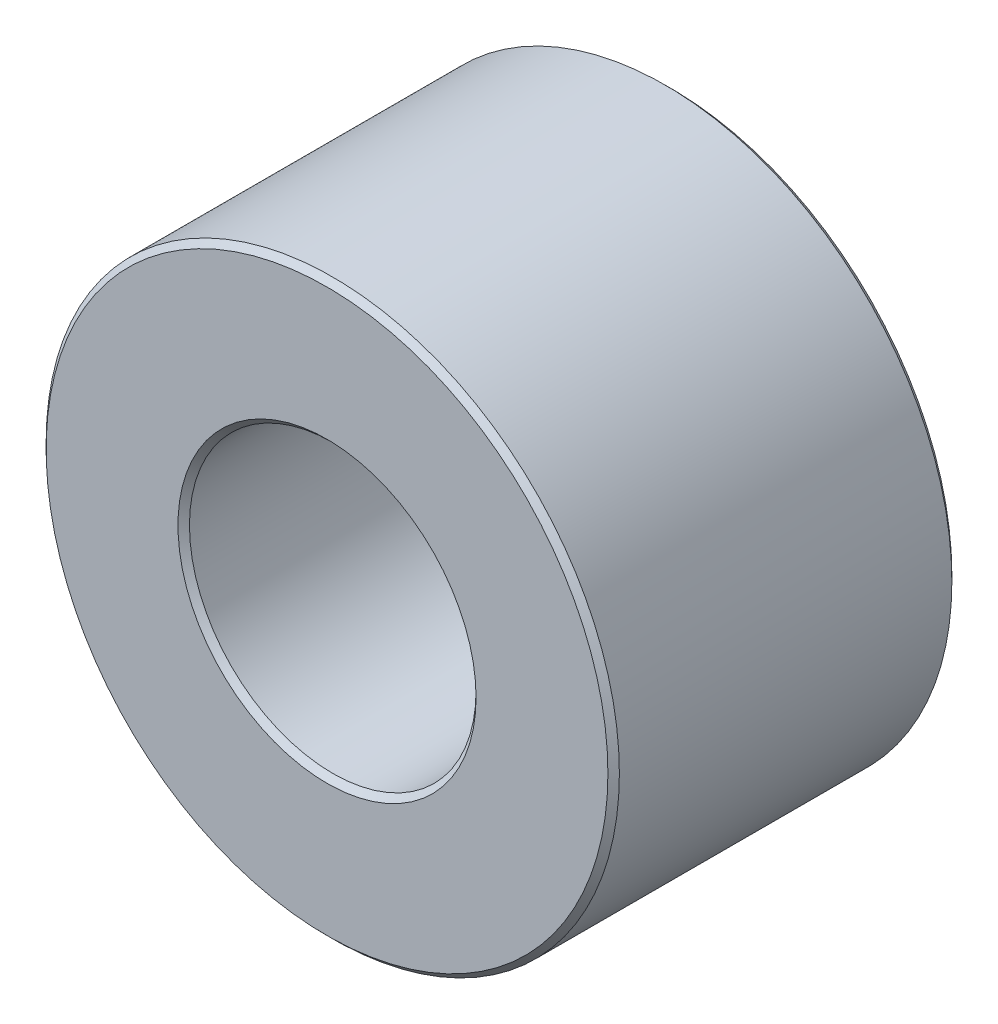
ISO-10303-21;
HEADER;
FILE_DESCRIPTION(('STEP AP214'),'2;1');
FILE_NAME('part.step','',(''),(''),'','','');
FILE_SCHEMA(('AUTOMOTIVE_DESIGN { 1 0 10303 214 1 1 1 1 }'));
ENDSEC;
DATA;
#1=APPLICATION_CONTEXT('core data for automotive mechanical design processes');
#2=APPLICATION_PROTOCOL_DEFINITION('international standard','automotive_design',2000,#1);
#3=PRODUCT_CONTEXT('',#1,'mechanical');
#4=PRODUCT('Part','Part','',(#3));
#5=PRODUCT_RELATED_PRODUCT_CATEGORY('part','',(#4));
#6=PRODUCT_DEFINITION_FORMATION('','',#4);
#7=PRODUCT_DEFINITION_CONTEXT('part definition',#1,'design');
#8=PRODUCT_DEFINITION('design','',#6,#7);
#9=PRODUCT_DEFINITION_SHAPE('','',#8);
#10=(LENGTH_UNIT() NAMED_UNIT(*) SI_UNIT(.MILLI.,.METRE.));
#11=(NAMED_UNIT(*) PLANE_ANGLE_UNIT() SI_UNIT($,.RADIAN.));
#12=(NAMED_UNIT(*) SI_UNIT($,.STERADIAN.) SOLID_ANGLE_UNIT());
#13=UNCERTAINTY_MEASURE_WITH_UNIT(LENGTH_MEASURE(1.E-05),#10,'distance_accuracy_value','');
#14=(GEOMETRIC_REPRESENTATION_CONTEXT(3) GLOBAL_UNCERTAINTY_ASSIGNED_CONTEXT((#13)) GLOBAL_UNIT_ASSIGNED_CONTEXT((#10,
#11,#12)) REPRESENTATION_CONTEXT('',''));
#15=CARTESIAN_POINT('',(0.,0.,0.));
#16=DIRECTION('',(0.,0.,1.));
#17=DIRECTION('',(1.,0.,0.));
#18=AXIS2_PLACEMENT_3D('',#15,#16,#17);
#19=CARTESIAN_POINT('',(0.,0.,-0.05));
#20=DIRECTION('',(0.,0.,-1.));
#21=DIRECTION('',(-1.,0.,0.));
#22=AXIS2_PLACEMENT_3D('',#19,#20,#21);
#23=CONICAL_SURFACE('',#22,4.95,0.785398163397449);
#24=CARTESIAN_POINT('',(0.,0.,-0.1));
#25=DIRECTION('',(0.,0.,1.));
#26=DIRECTION('',(1.,0.,0.));
#27=AXIS2_PLACEMENT_3D('',#24,#25,#26);
#28=CIRCLE('',#27,5.);
#29=CARTESIAN_POINT('',(5.,0.,-0.1));
#30=VERTEX_POINT('',#29);
#31=EDGE_CURVE('E11',#30,#30,#28,.T.);
#32=ORIENTED_EDGE('',*,*,#31,.T.);
#33=EDGE_LOOP('',(#32));
#34=FACE_BOUND('',#33,.T.);
#35=CARTESIAN_POINT('',(0.,0.,0.));
#36=DIRECTION('',(0.,0.,-1.));
#37=DIRECTION('',(1.,0.,0.));
#38=AXIS2_PLACEMENT_3D('',#35,#36,#37);
#39=CIRCLE('',#38,4.9);
#40=CARTESIAN_POINT('',(4.9,0.,0.));
#41=VERTEX_POINT('',#40);
#42=EDGE_CURVE('E65',#41,#41,#39,.T.);
#43=ORIENTED_EDGE('',*,*,#42,.T.);
#44=EDGE_LOOP('',(#43));
#45=FACE_BOUND('',#44,.T.);
#46=ADVANCED_FACE('F16',(#34,#45),#23,.T.);
#47=CARTESIAN_POINT('',(0.,0.,0.));
#48=DIRECTION('',(0.,0.,-1.));
#49=DIRECTION('',(-1.,0.,0.));
#50=AXIS2_PLACEMENT_3D('',#47,#48,#49);
#51=CYLINDRICAL_SURFACE('',#50,5.);
#52=ORIENTED_EDGE('',*,*,#31,.F.);
#53=EDGE_LOOP('',(#52));
#54=FACE_BOUND('',#53,.T.);
#55=CARTESIAN_POINT('',(0.,0.,-5.9));
#56=DIRECTION('',(0.,0.,-1.));
#57=DIRECTION('',(1.,0.,0.));
#58=AXIS2_PLACEMENT_3D('',#55,#56,#57);
#59=CIRCLE('',#58,5.);
#60=CARTESIAN_POINT('',(5.,0.,-5.9));
#61=VERTEX_POINT('',#60);
#62=EDGE_CURVE('E20',#61,#61,#59,.T.);
#63=ORIENTED_EDGE('',*,*,#62,.F.);
#64=EDGE_LOOP('',(#63));
#65=FACE_BOUND('',#64,.T.);
#66=ADVANCED_FACE('F18',(#54,#65),#51,.T.);
#67=CARTESIAN_POINT('',(0.,0.,-5.95));
#68=DIRECTION('',(0.,0.,1.));
#69=DIRECTION('',(-1.,0.,0.));
#70=AXIS2_PLACEMENT_3D('',#67,#68,#69);
#71=CONICAL_SURFACE('',#70,4.95,0.785398163397448);
#72=ORIENTED_EDGE('',*,*,#62,.T.);
#73=EDGE_LOOP('',(#72));
#74=FACE_BOUND('',#73,.T.);
#75=CARTESIAN_POINT('',(0.,0.,-6.));
#76=DIRECTION('',(0.,0.,1.));
#77=DIRECTION('',(1.,0.,0.));
#78=AXIS2_PLACEMENT_3D('',#75,#76,#77);
#79=CIRCLE('',#78,4.9);
#80=CARTESIAN_POINT('',(4.9,0.,-6.));
#81=VERTEX_POINT('',#80);
#82=EDGE_CURVE('E81',#81,#81,#79,.T.);
#83=ORIENTED_EDGE('',*,*,#82,.T.);
#84=EDGE_LOOP('',(#83));
#85=FACE_BOUND('',#84,.T.);
#86=ADVANCED_FACE('F94',(#74,#85),#71,.T.);
#87=CARTESIAN_POINT('',(0.,0.,-6.));
#88=DIRECTION('',(0.,0.,1.));
#89=DIRECTION('',(1.,0.,0.));
#90=AXIS2_PLACEMENT_3D('',#87,#88,#89);
#91=PLANE('',#90);
#92=CARTESIAN_POINT('',(0.,0.,-6.));
#93=DIRECTION('',(0.,0.,-1.));
#94=DIRECTION('',(1.,0.,0.));
#95=AXIS2_PLACEMENT_3D('',#92,#93,#94);
#96=CIRCLE('',#95,2.6);
#97=CARTESIAN_POINT('',(2.6,0.,-6.));
#98=VERTEX_POINT('',#97);
#99=EDGE_CURVE('E73',#98,#98,#96,.T.);
#100=ORIENTED_EDGE('',*,*,#99,.F.);
#101=EDGE_LOOP('',(#100));
#102=FACE_BOUND('',#101,.T.);
#103=ORIENTED_EDGE('',*,*,#82,.F.);
#104=EDGE_LOOP('',(#103));
#105=FACE_BOUND('',#104,.T.);
#106=ADVANCED_FACE('F103',(#102,#105),#91,.F.);
#107=CARTESIAN_POINT('',(0.,0.,-5.95));
#108=DIRECTION('',(0.,0.,-1.));
#109=DIRECTION('',(-1.,0.,0.));
#110=AXIS2_PLACEMENT_3D('',#107,#108,#109);
#111=CONICAL_SURFACE('',#110,2.55,0.785398163397448);
#112=ORIENTED_EDGE('',*,*,#99,.T.);
#113=EDGE_LOOP('',(#112));
#114=FACE_BOUND('',#113,.T.);
#115=CARTESIAN_POINT('',(0.,0.,-5.9));
#116=DIRECTION('',(0.,0.,1.));
#117=DIRECTION('',(1.,0.,0.));
#118=AXIS2_PLACEMENT_3D('',#115,#116,#117);
#119=CIRCLE('',#118,2.5);
#120=CARTESIAN_POINT('',(2.5,0.,-5.9));
#121=VERTEX_POINT('',#120);
#122=EDGE_CURVE('E61',#121,#121,#119,.T.);
#123=ORIENTED_EDGE('',*,*,#122,.T.);
#124=EDGE_LOOP('',(#123));
#125=FACE_BOUND('',#124,.T.);
#126=ADVANCED_FACE('F62',(#114,#125),#111,.F.);
#127=CARTESIAN_POINT('',(0.,0.,0.));
#128=DIRECTION('',(0.,0.,1.));
#129=DIRECTION('',(1.,0.,0.));
#130=AXIS2_PLACEMENT_3D('',#127,#128,#129);
#131=PLANE('',#130);
#132=CARTESIAN_POINT('',(0.,0.,0.));
#133=DIRECTION('',(0.,0.,1.));
#134=DIRECTION('',(1.,0.,0.));
#135=AXIS2_PLACEMENT_3D('',#132,#133,#134);
#136=CIRCLE('',#135,2.6);
#137=CARTESIAN_POINT('',(2.6,0.,0.));
#138=VERTEX_POINT('',#137);
#139=EDGE_CURVE('E66',#138,#138,#136,.T.);
#140=ORIENTED_EDGE('',*,*,#139,.F.);
#141=EDGE_LOOP('',(#140));
#142=FACE_BOUND('',#141,.T.);
#143=ORIENTED_EDGE('',*,*,#42,.F.);
#144=EDGE_LOOP('',(#143));
#145=FACE_BOUND('',#144,.T.);
#146=ADVANCED_FACE('F110',(#142,#145),#131,.T.);
#147=CARTESIAN_POINT('',(0.,0.,0.));
#148=DIRECTION('',(0.,0.,-1.));
#149=DIRECTION('',(-1.,0.,0.));
#150=AXIS2_PLACEMENT_3D('',#147,#148,#149);
#151=CYLINDRICAL_SURFACE('',#150,2.5);
#152=CARTESIAN_POINT('',(0.,0.,-0.1));
#153=DIRECTION('',(0.,0.,-1.));
#154=DIRECTION('',(1.,0.,0.));
#155=AXIS2_PLACEMENT_3D('',#152,#153,#154);
#156=CIRCLE('',#155,2.5);
#157=CARTESIAN_POINT('',(2.5,0.,-0.1));
#158=VERTEX_POINT('',#157);
#159=EDGE_CURVE('E75',#158,#158,#156,.T.);
#160=ORIENTED_EDGE('',*,*,#159,.F.);
#161=EDGE_LOOP('',(#160));
#162=FACE_BOUND('',#161,.T.);
#163=ORIENTED_EDGE('',*,*,#122,.F.);
#164=EDGE_LOOP('',(#163));
#165=FACE_BOUND('',#164,.T.);
#166=ADVANCED_FACE('F112',(#162,#165),#151,.F.);
#167=CARTESIAN_POINT('',(0.,0.,-0.05));
#168=DIRECTION('',(0.,0.,1.));
#169=DIRECTION('',(-1.,0.,0.));
#170=AXIS2_PLACEMENT_3D('',#167,#168,#169);
#171=CONICAL_SURFACE('',#170,2.55,0.785398163397449);
#172=ORIENTED_EDGE('',*,*,#139,.T.);
#173=EDGE_LOOP('',(#172));
#174=FACE_BOUND('',#173,.T.);
#175=ORIENTED_EDGE('',*,*,#159,.T.);
#176=EDGE_LOOP('',(#175));
#177=FACE_BOUND('',#176,.T.);
#178=ADVANCED_FACE('F115',(#174,#177),#171,.F.);
#179=CLOSED_SHELL('',(#46,#66,#86,#106,#126,#146,#166,#178));
#180=MANIFOLD_SOLID_BREP('B1',#179);
#181=ADVANCED_BREP_SHAPE_REPRESENTATION('',(#18,#180),#14);
#182=SHAPE_DEFINITION_REPRESENTATION(#9,#181);
ENDSEC;
END-ISO-10303-21;
